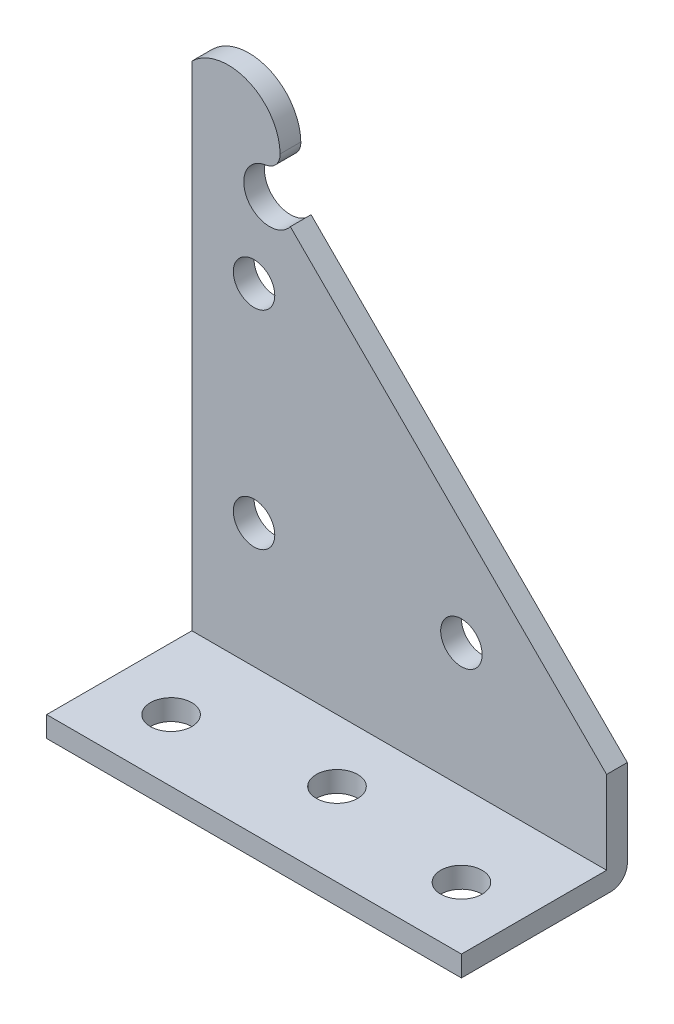
ISO-10303-21;
HEADER;
FILE_DESCRIPTION(('STEP AP214'),'2;1');
FILE_NAME('part.step','',(''),(''),'','','');
FILE_SCHEMA(('AUTOMOTIVE_DESIGN { 1 0 10303 214 1 1 1 1 }'));
ENDSEC;
DATA;
#1=APPLICATION_CONTEXT('core data for automotive mechanical design processes');
#2=APPLICATION_PROTOCOL_DEFINITION('international standard','automotive_design',2000,#1);
#3=PRODUCT_CONTEXT('',#1,'mechanical');
#4=PRODUCT('Part','Part','',(#3));
#5=PRODUCT_RELATED_PRODUCT_CATEGORY('part','',(#4));
#6=PRODUCT_DEFINITION_FORMATION('','',#4);
#7=PRODUCT_DEFINITION_CONTEXT('part definition',#1,'design');
#8=PRODUCT_DEFINITION('design','',#6,#7);
#9=PRODUCT_DEFINITION_SHAPE('','',#8);
#10=(LENGTH_UNIT() NAMED_UNIT(*) SI_UNIT(.MILLI.,.METRE.));
#11=(NAMED_UNIT(*) PLANE_ANGLE_UNIT() SI_UNIT($,.RADIAN.));
#12=(NAMED_UNIT(*) SI_UNIT($,.STERADIAN.) SOLID_ANGLE_UNIT());
#13=UNCERTAINTY_MEASURE_WITH_UNIT(LENGTH_MEASURE(1.E-05),#10,'distance_accuracy_value','');
#14=(GEOMETRIC_REPRESENTATION_CONTEXT(3) GLOBAL_UNCERTAINTY_ASSIGNED_CONTEXT((#13)) GLOBAL_UNIT_ASSIGNED_CONTEXT((#10,
#11,#12)) REPRESENTATION_CONTEXT('',''));
#15=CARTESIAN_POINT('',(0.,0.,0.));
#16=DIRECTION('',(0.,0.,1.));
#17=DIRECTION('',(1.,0.,0.));
#18=AXIS2_PLACEMENT_3D('',#15,#16,#17);
#19=CARTESIAN_POINT('',(0.,3.175,0.));
#20=DIRECTION('',(0.,1.,0.));
#21=DIRECTION('',(0.,0.,1.));
#22=AXIS2_PLACEMENT_3D('',#19,#20,#21);
#23=PLANE('',#22);
#24=DIRECTION('',(1.,0.,0.));
#25=VECTOR('',#24,1.);
#26=CARTESIAN_POINT('',(0.,3.175,-9.525));
#27=LINE('',#26,#25);
#28=CARTESIAN_POINT('',(-31.75,3.175,-9.525));
#29=VERTEX_POINT('',#28);
#30=CARTESIAN_POINT('',(31.75,3.175,-9.525));
#31=VERTEX_POINT('',#30);
#32=EDGE_CURVE('E117',#29,#31,#27,.T.);
#33=ORIENTED_EDGE('',*,*,#32,.F.);
#34=DIRECTION('',(0.,0.,1.));
#35=VECTOR('',#34,1.);
#36=CARTESIAN_POINT('',(-31.75,3.175,12.7));
#37=LINE('',#36,#35);
#38=CARTESIAN_POINT('',(-31.75,3.175,12.7));
#39=VERTEX_POINT('',#38);
#40=EDGE_CURVE('E184',#29,#39,#37,.T.);
#41=ORIENTED_EDGE('',*,*,#40,.T.);
#42=DIRECTION('',(1.,0.,0.));
#43=VECTOR('',#42,1.);
#44=CARTESIAN_POINT('',(31.75,3.175,12.7));
#45=LINE('',#44,#43);
#46=CARTESIAN_POINT('',(31.75,3.175,12.7));
#47=VERTEX_POINT('',#46);
#48=EDGE_CURVE('E186',#39,#47,#45,.T.);
#49=ORIENTED_EDGE('',*,*,#48,.T.);
#50=DIRECTION('',(0.,0.,-1.));
#51=VECTOR('',#50,1.);
#52=CARTESIAN_POINT('',(31.75,3.175,12.7));
#53=LINE('',#52,#51);
#54=EDGE_CURVE('E189',#47,#31,#53,.T.);
#55=ORIENTED_EDGE('',*,*,#54,.T.);
#56=EDGE_LOOP('',(#33,#41,#49,#55));
#57=FACE_BOUND('',#56,.T.);
#58=CARTESIAN_POINT('',(0.,3.175,0.));
#59=DIRECTION('',(0.,1.,0.));
#60=DIRECTION('',(0.,0.,1.));
#61=AXIS2_PLACEMENT_3D('',#58,#59,#60);
#62=CIRCLE('',#61,3.175);
#63=CARTESIAN_POINT('',(0.,3.175,3.175));
#64=VERTEX_POINT('',#63);
#65=EDGE_CURVE('E172',#64,#64,#62,.T.);
#66=ORIENTED_EDGE('',*,*,#65,.F.);
#67=EDGE_LOOP('',(#66));
#68=FACE_BOUND('',#67,.T.);
#69=CARTESIAN_POINT('',(-22.225,3.175,3.175));
#70=DIRECTION('',(0.,1.,0.));
#71=DIRECTION('',(0.,0.,1.));
#72=AXIS2_PLACEMENT_3D('',#69,#70,#71);
#73=CIRCLE('',#72,3.175);
#74=CARTESIAN_POINT('',(-22.225,3.175,6.35));
#75=VERTEX_POINT('',#74);
#76=EDGE_CURVE('E178',#75,#75,#73,.T.);
#77=ORIENTED_EDGE('',*,*,#76,.F.);
#78=EDGE_LOOP('',(#77));
#79=FACE_BOUND('',#78,.T.);
#80=CARTESIAN_POINT('',(22.225,3.175,3.175));
#81=DIRECTION('',(0.,1.,0.));
#82=DIRECTION('',(0.,0.,-1.));
#83=AXIS2_PLACEMENT_3D('',#80,#81,#82);
#84=CIRCLE('',#83,3.175);
#85=CARTESIAN_POINT('',(22.225,3.175,0.));
#86=VERTEX_POINT('',#85);
#87=EDGE_CURVE('E166',#86,#86,#84,.T.);
#88=ORIENTED_EDGE('',*,*,#87,.F.);
#89=EDGE_LOOP('',(#88));
#90=FACE_BOUND('',#89,.T.);
#91=ADVANCED_FACE('F32',(#57,#68,#79,#90),#23,.T.);
#92=CARTESIAN_POINT('',(0.,0.,0.));
#93=DIRECTION('',(0.,1.,0.));
#94=DIRECTION('',(0.,0.,1.));
#95=AXIS2_PLACEMENT_3D('',#92,#93,#94);
#96=PLANE('',#95);
#97=DIRECTION('',(0.,0.,1.));
#98=VECTOR('',#97,1.);
#99=CARTESIAN_POINT('',(-31.75,0.,12.7));
#100=LINE('',#99,#98);
#101=CARTESIAN_POINT('',(-31.75,0.,-10.16));
#102=VERTEX_POINT('',#101);
#103=CARTESIAN_POINT('',(-31.75,0.,12.7));
#104=VERTEX_POINT('',#103);
#105=EDGE_CURVE('E181',#102,#104,#100,.T.);
#106=ORIENTED_EDGE('',*,*,#105,.F.);
#107=DIRECTION('',(-1.,0.,0.));
#108=VECTOR('',#107,1.);
#109=CARTESIAN_POINT('',(0.,0.,-10.16));
#110=LINE('',#109,#108);
#111=CARTESIAN_POINT('',(31.75,0.,-10.16));
#112=VERTEX_POINT('',#111);
#113=EDGE_CURVE('E40',#102,#112,#110,.F.);
#114=ORIENTED_EDGE('',*,*,#113,.T.);
#115=DIRECTION('',(0.,0.,-1.));
#116=VECTOR('',#115,1.);
#117=CARTESIAN_POINT('',(31.75,0.,12.7));
#118=LINE('',#117,#116);
#119=CARTESIAN_POINT('',(31.75,0.,12.7));
#120=VERTEX_POINT('',#119);
#121=EDGE_CURVE('E187',#120,#112,#118,.T.);
#122=ORIENTED_EDGE('',*,*,#121,.F.);
#123=DIRECTION('',(1.,0.,0.));
#124=VECTOR('',#123,1.);
#125=CARTESIAN_POINT('',(31.75,0.,12.7));
#126=LINE('',#125,#124);
#127=EDGE_CURVE('E193',#104,#120,#126,.T.);
#128=ORIENTED_EDGE('',*,*,#127,.F.);
#129=EDGE_LOOP('',(#106,#114,#122,#128));
#130=FACE_BOUND('',#129,.T.);
#131=CARTESIAN_POINT('',(-22.225,0.,3.175));
#132=DIRECTION('',(0.,1.,0.));
#133=DIRECTION('',(0.,0.,1.));
#134=AXIS2_PLACEMENT_3D('',#131,#132,#133);
#135=CIRCLE('',#134,3.175);
#136=CARTESIAN_POINT('',(-22.225,0.,6.35));
#137=VERTEX_POINT('',#136);
#138=EDGE_CURVE('E175',#137,#137,#135,.T.);
#139=ORIENTED_EDGE('',*,*,#138,.T.);
#140=EDGE_LOOP('',(#139));
#141=FACE_BOUND('',#140,.T.);
#142=CARTESIAN_POINT('',(0.,0.,0.));
#143=DIRECTION('',(0.,1.,0.));
#144=DIRECTION('',(0.,0.,1.));
#145=AXIS2_PLACEMENT_3D('',#142,#143,#144);
#146=CIRCLE('',#145,3.175);
#147=CARTESIAN_POINT('',(0.,0.,3.175));
#148=VERTEX_POINT('',#147);
#149=EDGE_CURVE('E169',#148,#148,#146,.T.);
#150=ORIENTED_EDGE('',*,*,#149,.T.);
#151=EDGE_LOOP('',(#150));
#152=FACE_BOUND('',#151,.T.);
#153=CARTESIAN_POINT('',(22.225,0.,3.175));
#154=DIRECTION('',(0.,1.,0.));
#155=DIRECTION('',(0.,0.,-1.));
#156=AXIS2_PLACEMENT_3D('',#153,#154,#155);
#157=CIRCLE('',#156,3.175);
#158=CARTESIAN_POINT('',(22.225,0.,0.));
#159=VERTEX_POINT('',#158);
#160=EDGE_CURVE('E165',#159,#159,#157,.T.);
#161=ORIENTED_EDGE('',*,*,#160,.T.);
#162=EDGE_LOOP('',(#161));
#163=FACE_BOUND('',#162,.T.);
#164=ADVANCED_FACE('F238',(#130,#141,#152,#163),#96,.F.);
#165=CARTESIAN_POINT('',(-31.75,3.175,12.7));
#166=DIRECTION('',(1.,0.,0.));
#167=DIRECTION('',(0.,0.,-1.));
#168=AXIS2_PLACEMENT_3D('',#165,#166,#167);
#169=PLANE('',#168);
#170=DIRECTION('',(0.,-1.,0.));
#171=VECTOR('',#170,1.);
#172=CARTESIAN_POINT('',(-31.75,3.175,-12.7));
#173=LINE('',#172,#171);
#174=CARTESIAN_POINT('',(-31.75,78.7050670136892,-12.7));
#175=VERTEX_POINT('',#174);
#176=CARTESIAN_POINT('',(-31.75,2.54,-12.7));
#177=VERTEX_POINT('',#176);
#178=EDGE_CURVE('E191',#175,#177,#173,.T.);
#179=ORIENTED_EDGE('',*,*,#178,.T.);
#180=CARTESIAN_POINT('',(-31.75,2.54,-10.16));
#181=DIRECTION('',(1.,0.,0.));
#182=DIRECTION('',(0.,0.,-1.));
#183=AXIS2_PLACEMENT_3D('',#180,#181,#182);
#184=CIRCLE('',#183,2.54);
#185=EDGE_CURVE('E54',#177,#102,#184,.F.);
#186=ORIENTED_EDGE('',*,*,#185,.T.);
#187=ORIENTED_EDGE('',*,*,#105,.T.);
#188=DIRECTION('',(0.,-1.,0.));
#189=VECTOR('',#188,1.);
#190=CARTESIAN_POINT('',(-31.75,3.175,12.7));
#191=LINE('',#190,#189);
#192=EDGE_CURVE('E201',#39,#104,#191,.T.);
#193=ORIENTED_EDGE('',*,*,#192,.F.);
#194=ORIENTED_EDGE('',*,*,#40,.F.);
#195=DIRECTION('',(0.,-1.,0.));
#196=VECTOR('',#195,1.);
#197=CARTESIAN_POINT('',(-31.75,0.,-9.525));
#198=LINE('',#197,#196);
#199=CARTESIAN_POINT('',(-31.75,78.7050670136892,-9.525));
#200=VERTEX_POINT('',#199);
#201=EDGE_CURVE('E143',#200,#29,#198,.T.);
#202=ORIENTED_EDGE('',*,*,#201,.F.);
#203=DIRECTION('',(0.,0.,-1.));
#204=VECTOR('',#203,1.);
#205=CARTESIAN_POINT('',(-31.75,78.7050670136892,-9.525));
#206=LINE('',#205,#204);
#207=EDGE_CURVE('E145',#200,#175,#206,.T.);
#208=ORIENTED_EDGE('',*,*,#207,.T.);
#209=EDGE_LOOP('',(#179,#186,#187,#193,#194,#202,#208));
#210=FACE_BOUND('',#209,.T.);
#211=ADVANCED_FACE('F214',(#210),#169,.F.);
#212=CARTESIAN_POINT('',(31.75,3.175,12.7));
#213=DIRECTION('',(0.,0.,-1.));
#214=DIRECTION('',(-1.,0.,0.));
#215=AXIS2_PLACEMENT_3D('',#212,#213,#214);
#216=PLANE('',#215);
#217=ORIENTED_EDGE('',*,*,#127,.T.);
#218=DIRECTION('',(0.,-1.,0.));
#219=VECTOR('',#218,1.);
#220=CARTESIAN_POINT('',(31.75,3.175,12.7));
#221=LINE('',#220,#219);
#222=EDGE_CURVE('E198',#47,#120,#221,.T.);
#223=ORIENTED_EDGE('',*,*,#222,.F.);
#224=ORIENTED_EDGE('',*,*,#48,.F.);
#225=ORIENTED_EDGE('',*,*,#192,.T.);
#226=EDGE_LOOP('',(#217,#223,#224,#225));
#227=FACE_BOUND('',#226,.T.);
#228=ADVANCED_FACE('F254',(#227),#216,.F.);
#229=CARTESIAN_POINT('',(31.75,3.175,12.7));
#230=DIRECTION('',(-1.,0.,0.));
#231=DIRECTION('',(0.,0.,1.));
#232=AXIS2_PLACEMENT_3D('',#229,#230,#231);
#233=PLANE('',#232);
#234=ORIENTED_EDGE('',*,*,#121,.T.);
#235=CARTESIAN_POINT('',(31.75,2.54,-10.16));
#236=DIRECTION('',(-1.,0.,0.));
#237=DIRECTION('',(0.,0.,1.));
#238=AXIS2_PLACEMENT_3D('',#235,#236,#237);
#239=CIRCLE('',#238,2.54);
#240=CARTESIAN_POINT('',(31.75,2.54,-12.7));
#241=VERTEX_POINT('',#240);
#242=EDGE_CURVE('E11',#112,#241,#239,.F.);
#243=ORIENTED_EDGE('',*,*,#242,.T.);
#244=DIRECTION('',(0.,-1.,0.));
#245=VECTOR('',#244,1.);
#246=CARTESIAN_POINT('',(31.75,3.175,-12.7));
#247=LINE('',#246,#245);
#248=CARTESIAN_POINT('',(31.75,15.875,-12.7));
#249=VERTEX_POINT('',#248);
#250=EDGE_CURVE('E126',#249,#241,#247,.T.);
#251=ORIENTED_EDGE('',*,*,#250,.F.);
#252=DIRECTION('',(0.,0.,-1.));
#253=VECTOR('',#252,1.);
#254=CARTESIAN_POINT('',(31.75,15.875,-9.525));
#255=LINE('',#254,#253);
#256=CARTESIAN_POINT('',(31.75,15.875,-9.525));
#257=VERTEX_POINT('',#256);
#258=EDGE_CURVE('E123',#257,#249,#255,.T.);
#259=ORIENTED_EDGE('',*,*,#258,.F.);
#260=DIRECTION('',(0.,1.,0.));
#261=VECTOR('',#260,1.);
#262=CARTESIAN_POINT('',(31.75,0.,-9.525));
#263=LINE('',#262,#261);
#264=EDGE_CURVE('E108',#31,#257,#263,.T.);
#265=ORIENTED_EDGE('',*,*,#264,.F.);
#266=ORIENTED_EDGE('',*,*,#54,.F.);
#267=ORIENTED_EDGE('',*,*,#222,.T.);
#268=EDGE_LOOP('',(#234,#243,#251,#259,#265,#266,#267));
#269=FACE_BOUND('',#268,.T.);
#270=ADVANCED_FACE('F124',(#269),#233,.F.);
#271=CARTESIAN_POINT('',(31.75,3.175,-12.7));
#272=DIRECTION('',(0.,0.,1.));
#273=DIRECTION('',(1.,0.,0.));
#274=AXIS2_PLACEMENT_3D('',#271,#272,#273);
#275=PLANE('',#274);
#276=ORIENTED_EDGE('',*,*,#250,.T.);
#277=DIRECTION('',(-1.,0.,0.));
#278=VECTOR('',#277,1.);
#279=CARTESIAN_POINT('',(31.75,2.54,-12.7));
#280=LINE('',#279,#278);
#281=EDGE_CURVE('E204',#241,#177,#280,.T.);
#282=ORIENTED_EDGE('',*,*,#281,.T.);
#283=ORIENTED_EDGE('',*,*,#178,.F.);
#284=CARTESIAN_POINT('',(-26.1874,73.025,-12.7));
#285=DIRECTION('',(0.,0.,1.));
#286=DIRECTION('',(-1.,0.,0.));
#287=AXIS2_PLACEMENT_3D('',#284,#285,#286);
#288=CIRCLE('',#287,7.9502);
#289=CARTESIAN_POINT('',(-18.2381590173172,73.1484821413682,-12.7));
#290=VERTEX_POINT('',#289);
#291=EDGE_CURVE('E120',#290,#175,#288,.T.);
#292=ORIENTED_EDGE('',*,*,#291,.F.);
#293=CARTESIAN_POINT('',(-20.7778526220082,73.1090309779918,-12.7));
#294=DIRECTION('',(0.,0.,1.));
#295=DIRECTION('',(-1.,0.,0.));
#296=AXIS2_PLACEMENT_3D('',#293,#294,#295);
#297=CIRCLE('',#296,2.54000000000001);
#298=CARTESIAN_POINT('',(-20.4104883165363,70.5957376272138,-12.7));
#299=VERTEX_POINT('',#298);
#300=EDGE_CURVE('E151',#299,#290,#297,.T.);
#301=ORIENTED_EDGE('',*,*,#300,.F.);
#302=CARTESIAN_POINT('',(-19.8374,66.675,-12.7));
#303=DIRECTION('',(0.,0.,-1.));
#304=DIRECTION('',(1.,0.,0.));
#305=AXIS2_PLACEMENT_3D('',#302,#303,#304);
#306=CIRCLE('',#305,3.96240000000001);
#307=CARTESIAN_POINT('',(-16.6696583294408,64.2946583294403,-12.7));
#308=VERTEX_POINT('',#307);
#309=EDGE_CURVE('E148',#308,#299,#306,.T.);
#310=ORIENTED_EDGE('',*,*,#309,.F.);
#311=DIRECTION('',(-0.707106781186551,0.707106781186544,0.));
#312=VECTOR('',#311,1.);
#313=CARTESIAN_POINT('',(31.75,15.875,-12.7));
#314=LINE('',#313,#312);
#315=EDGE_CURVE('E146',#249,#308,#314,.T.);
#316=ORIENTED_EDGE('',*,*,#315,.F.);
#317=EDGE_LOOP('',(#276,#282,#283,#292,#301,#310,#316));
#318=FACE_BOUND('',#317,.T.);
#319=CARTESIAN_POINT('',(-22.225,22.225,-12.7));
#320=DIRECTION('',(0.,0.,1.));
#321=DIRECTION('',(1.,0.,0.));
#322=AXIS2_PLACEMENT_3D('',#319,#320,#321);
#323=CIRCLE('',#322,3.175);
#324=CARTESIAN_POINT('',(-19.05,22.225,-12.7));
#325=VERTEX_POINT('',#324);
#326=EDGE_CURVE('E426',#325,#325,#323,.T.);
#327=ORIENTED_EDGE('',*,*,#326,.T.);
#328=EDGE_LOOP('',(#327));
#329=FACE_BOUND('',#328,.T.);
#330=CARTESIAN_POINT('',(-22.225,53.975,-12.7));
#331=DIRECTION('',(0.,0.,1.));
#332=DIRECTION('',(1.,0.,0.));
#333=AXIS2_PLACEMENT_3D('',#330,#331,#332);
#334=CIRCLE('',#333,3.175);
#335=CARTESIAN_POINT('',(-19.05,53.975,-12.7));
#336=VERTEX_POINT('',#335);
#337=EDGE_CURVE('E420',#336,#336,#334,.T.);
#338=ORIENTED_EDGE('',*,*,#337,.T.);
#339=EDGE_LOOP('',(#338));
#340=FACE_BOUND('',#339,.T.);
#341=CARTESIAN_POINT('',(9.525,22.225,-12.7));
#342=DIRECTION('',(0.,0.,1.));
#343=DIRECTION('',(1.,0.,0.));
#344=AXIS2_PLACEMENT_3D('',#341,#342,#343);
#345=CIRCLE('',#344,3.175);
#346=CARTESIAN_POINT('',(12.7,22.225,-12.7));
#347=VERTEX_POINT('',#346);
#348=EDGE_CURVE('E417',#347,#347,#345,.T.);
#349=ORIENTED_EDGE('',*,*,#348,.T.);
#350=EDGE_LOOP('',(#349));
#351=FACE_BOUND('',#350,.T.);
#352=ADVANCED_FACE('F209',(#318,#329,#340,#351),#275,.F.);
#353=CARTESIAN_POINT('',(-22.225,3.175,3.175));
#354=DIRECTION('',(0.,-1.,0.));
#355=DIRECTION('',(0.,0.,-1.));
#356=AXIS2_PLACEMENT_3D('',#353,#354,#355);
#357=CYLINDRICAL_SURFACE('',#356,3.175);
#358=ORIENTED_EDGE('',*,*,#76,.T.);
#359=EDGE_LOOP('',(#358));
#360=FACE_BOUND('',#359,.T.);
#361=ORIENTED_EDGE('',*,*,#138,.F.);
#362=EDGE_LOOP('',(#361));
#363=FACE_BOUND('',#362,.T.);
#364=ADVANCED_FACE('F247',(#360,#363),#357,.F.);
#365=CARTESIAN_POINT('',(0.,3.175,0.));
#366=DIRECTION('',(0.,-1.,0.));
#367=DIRECTION('',(0.,0.,-1.));
#368=AXIS2_PLACEMENT_3D('',#365,#366,#367);
#369=CYLINDRICAL_SURFACE('',#368,3.175);
#370=ORIENTED_EDGE('',*,*,#65,.T.);
#371=EDGE_LOOP('',(#370));
#372=FACE_BOUND('',#371,.T.);
#373=ORIENTED_EDGE('',*,*,#149,.F.);
#374=EDGE_LOOP('',(#373));
#375=FACE_BOUND('',#374,.T.);
#376=ADVANCED_FACE('F281',(#372,#375),#369,.F.);
#377=CARTESIAN_POINT('',(22.225,3.175,3.175));
#378=DIRECTION('',(0.,-1.,0.));
#379=DIRECTION('',(0.,0.,-1.));
#380=AXIS2_PLACEMENT_3D('',#377,#378,#379);
#381=CYLINDRICAL_SURFACE('',#380,3.175);
#382=ORIENTED_EDGE('',*,*,#87,.T.);
#383=EDGE_LOOP('',(#382));
#384=FACE_BOUND('',#383,.T.);
#385=ORIENTED_EDGE('',*,*,#160,.F.);
#386=EDGE_LOOP('',(#385));
#387=FACE_BOUND('',#386,.T.);
#388=ADVANCED_FACE('F288',(#384,#387),#381,.F.);
#389=CARTESIAN_POINT('',(-19.8374,66.675,-9.525));
#390=DIRECTION('',(0.,0.,1.));
#391=DIRECTION('',(1.,0.,0.));
#392=AXIS2_PLACEMENT_3D('',#389,#390,#391);
#393=PLANE('',#392);
#394=CARTESIAN_POINT('',(-22.225,53.975,-9.525));
#395=DIRECTION('',(0.,0.,1.));
#396=DIRECTION('',(1.,0.,0.));
#397=AXIS2_PLACEMENT_3D('',#394,#395,#396);
#398=CIRCLE('',#397,3.175);
#399=CARTESIAN_POINT('',(-19.05,53.975,-9.525));
#400=VERTEX_POINT('',#399);
#401=EDGE_CURVE('E423',#400,#400,#398,.T.);
#402=ORIENTED_EDGE('',*,*,#401,.F.);
#403=EDGE_LOOP('',(#402));
#404=FACE_BOUND('',#403,.T.);
#405=ORIENTED_EDGE('',*,*,#201,.T.);
#406=ORIENTED_EDGE('',*,*,#32,.T.);
#407=ORIENTED_EDGE('',*,*,#264,.T.);
#408=DIRECTION('',(-0.707106781186551,0.707106781186544,0.));
#409=VECTOR('',#408,1.);
#410=CARTESIAN_POINT('',(31.75,15.875,-9.525));
#411=LINE('',#410,#409);
#412=CARTESIAN_POINT('',(-16.6696583294408,64.2946583294403,-9.525));
#413=VERTEX_POINT('',#412);
#414=EDGE_CURVE('E114',#257,#413,#411,.T.);
#415=ORIENTED_EDGE('',*,*,#414,.T.);
#416=CARTESIAN_POINT('',(-19.8374,66.675,-9.525));
#417=DIRECTION('',(0.,0.,-1.));
#418=DIRECTION('',(1.,0.,0.));
#419=AXIS2_PLACEMENT_3D('',#416,#417,#418);
#420=CIRCLE('',#419,3.96240000000001);
#421=CARTESIAN_POINT('',(-20.4104883165363,70.5957376272138,-9.525));
#422=VERTEX_POINT('',#421);
#423=EDGE_CURVE('E134',#413,#422,#420,.T.);
#424=ORIENTED_EDGE('',*,*,#423,.T.);
#425=CARTESIAN_POINT('',(-20.7778526220082,73.1090309779918,-9.525));
#426=DIRECTION('',(0.,0.,1.));
#427=DIRECTION('',(-1.,0.,0.));
#428=AXIS2_PLACEMENT_3D('',#425,#426,#427);
#429=CIRCLE('',#428,2.54000000000001);
#430=CARTESIAN_POINT('',(-18.2381590173172,73.1484821413682,-9.525));
#431=VERTEX_POINT('',#430);
#432=EDGE_CURVE('E136',#422,#431,#429,.T.);
#433=ORIENTED_EDGE('',*,*,#432,.T.);
#434=CARTESIAN_POINT('',(-26.1874,73.025,-9.525));
#435=DIRECTION('',(0.,0.,1.));
#436=DIRECTION('',(-1.,0.,0.));
#437=AXIS2_PLACEMENT_3D('',#434,#435,#436);
#438=CIRCLE('',#437,7.9502);
#439=EDGE_CURVE('E141',#431,#200,#438,.T.);
#440=ORIENTED_EDGE('',*,*,#439,.T.);
#441=EDGE_LOOP('',(#405,#406,#407,#415,#424,#433,#440));
#442=FACE_BOUND('',#441,.T.);
#443=CARTESIAN_POINT('',(-22.225,22.225,-9.525));
#444=DIRECTION('',(0.,0.,1.));
#445=DIRECTION('',(1.,0.,0.));
#446=AXIS2_PLACEMENT_3D('',#443,#444,#445);
#447=CIRCLE('',#446,3.175);
#448=CARTESIAN_POINT('',(-19.05,22.225,-9.525));
#449=VERTEX_POINT('',#448);
#450=EDGE_CURVE('E149',#449,#449,#447,.T.);
#451=ORIENTED_EDGE('',*,*,#450,.F.);
#452=EDGE_LOOP('',(#451));
#453=FACE_BOUND('',#452,.T.);
#454=CARTESIAN_POINT('',(9.525,22.225,-9.525));
#455=DIRECTION('',(0.,0.,1.));
#456=DIRECTION('',(1.,0.,0.));
#457=AXIS2_PLACEMENT_3D('',#454,#455,#456);
#458=CIRCLE('',#457,3.175);
#459=CARTESIAN_POINT('',(12.7,22.225,-9.525));
#460=VERTEX_POINT('',#459);
#461=EDGE_CURVE('E414',#460,#460,#458,.T.);
#462=ORIENTED_EDGE('',*,*,#461,.F.);
#463=EDGE_LOOP('',(#462));
#464=FACE_BOUND('',#463,.T.);
#465=ADVANCED_FACE('F111',(#404,#442,#453,#464),#393,.T.);
#466=CARTESIAN_POINT('',(31.75,15.875,-9.525));
#467=DIRECTION('',(-0.707106781186544,-0.707106781186551,0.));
#468=DIRECTION('',(0.707106781186551,-0.707106781186544,0.));
#469=AXIS2_PLACEMENT_3D('',#466,#467,#468);
#470=PLANE('',#469);
#471=ORIENTED_EDGE('',*,*,#315,.T.);
#472=DIRECTION('',(0.,0.,-1.));
#473=VECTOR('',#472,1.);
#474=CARTESIAN_POINT('',(-16.6696583294408,64.2946583294403,-9.525));
#475=LINE('',#474,#473);
#476=EDGE_CURVE('E129',#413,#308,#475,.T.);
#477=ORIENTED_EDGE('',*,*,#476,.F.);
#478=ORIENTED_EDGE('',*,*,#414,.F.);
#479=ORIENTED_EDGE('',*,*,#258,.T.);
#480=EDGE_LOOP('',(#471,#477,#478,#479));
#481=FACE_BOUND('',#480,.T.);
#482=ADVANCED_FACE('F131',(#481),#470,.F.);
#483=CARTESIAN_POINT('',(-19.8374,66.675,-9.525));
#484=DIRECTION('',(0.,0.,-1.));
#485=DIRECTION('',(-1.,0.,0.));
#486=AXIS2_PLACEMENT_3D('',#483,#484,#485);
#487=CYLINDRICAL_SURFACE('',#486,3.96240000000001);
#488=ORIENTED_EDGE('',*,*,#309,.T.);
#489=DIRECTION('',(0.,0.,-1.));
#490=VECTOR('',#489,1.);
#491=CARTESIAN_POINT('',(-20.4104883165363,70.5957376272138,-9.525));
#492=LINE('',#491,#490);
#493=EDGE_CURVE('E160',#422,#299,#492,.T.);
#494=ORIENTED_EDGE('',*,*,#493,.F.);
#495=ORIENTED_EDGE('',*,*,#423,.F.);
#496=ORIENTED_EDGE('',*,*,#476,.T.);
#497=EDGE_LOOP('',(#488,#494,#495,#496));
#498=FACE_BOUND('',#497,.T.);
#499=ADVANCED_FACE('F228',(#498),#487,.F.);
#500=CARTESIAN_POINT('',(-20.7778526220082,73.1090309779918,-9.525));
#501=DIRECTION('',(0.,0.,-1.));
#502=DIRECTION('',(-1.,0.,0.));
#503=AXIS2_PLACEMENT_3D('',#500,#501,#502);
#504=CYLINDRICAL_SURFACE('',#503,2.54000000000001);
#505=ORIENTED_EDGE('',*,*,#300,.T.);
#506=DIRECTION('',(0.,0.,-1.));
#507=VECTOR('',#506,1.);
#508=CARTESIAN_POINT('',(-18.2381590173172,73.1484821413682,-9.525));
#509=LINE('',#508,#507);
#510=EDGE_CURVE('E157',#431,#290,#509,.T.);
#511=ORIENTED_EDGE('',*,*,#510,.F.);
#512=ORIENTED_EDGE('',*,*,#432,.F.);
#513=ORIENTED_EDGE('',*,*,#493,.T.);
#514=EDGE_LOOP('',(#505,#511,#512,#513));
#515=FACE_BOUND('',#514,.T.);
#516=ADVANCED_FACE('F224',(#515),#504,.T.);
#517=CARTESIAN_POINT('',(-26.1874,73.025,-9.525));
#518=DIRECTION('',(0.,0.,-1.));
#519=DIRECTION('',(-1.,0.,0.));
#520=AXIS2_PLACEMENT_3D('',#517,#518,#519);
#521=CYLINDRICAL_SURFACE('',#520,7.9502);
#522=ORIENTED_EDGE('',*,*,#291,.T.);
#523=ORIENTED_EDGE('',*,*,#207,.F.);
#524=ORIENTED_EDGE('',*,*,#439,.F.);
#525=ORIENTED_EDGE('',*,*,#510,.T.);
#526=EDGE_LOOP('',(#522,#523,#524,#525));
#527=FACE_BOUND('',#526,.T.);
#528=ADVANCED_FACE('F219',(#527),#521,.T.);
#529=CARTESIAN_POINT('',(-22.225,22.225,-9.525));
#530=DIRECTION('',(0.,0.,-1.));
#531=DIRECTION('',(-1.,0.,0.));
#532=AXIS2_PLACEMENT_3D('',#529,#530,#531);
#533=CYLINDRICAL_SURFACE('',#532,3.175);
#534=ORIENTED_EDGE('',*,*,#450,.T.);
#535=EDGE_LOOP('',(#534));
#536=FACE_BOUND('',#535,.T.);
#537=ORIENTED_EDGE('',*,*,#326,.F.);
#538=EDGE_LOOP('',(#537));
#539=FACE_BOUND('',#538,.T.);
#540=ADVANCED_FACE('F326',(#536,#539),#533,.F.);
#541=CARTESIAN_POINT('',(-22.225,53.975,-9.525));
#542=DIRECTION('',(0.,0.,-1.));
#543=DIRECTION('',(-1.,0.,0.));
#544=AXIS2_PLACEMENT_3D('',#541,#542,#543);
#545=CYLINDRICAL_SURFACE('',#544,3.175);
#546=ORIENTED_EDGE('',*,*,#401,.T.);
#547=EDGE_LOOP('',(#546));
#548=FACE_BOUND('',#547,.T.);
#549=ORIENTED_EDGE('',*,*,#337,.F.);
#550=EDGE_LOOP('',(#549));
#551=FACE_BOUND('',#550,.T.);
#552=ADVANCED_FACE('F335',(#548,#551),#545,.F.);
#553=CARTESIAN_POINT('',(9.525,22.225,-9.525));
#554=DIRECTION('',(0.,0.,-1.));
#555=DIRECTION('',(-1.,0.,0.));
#556=AXIS2_PLACEMENT_3D('',#553,#554,#555);
#557=CYLINDRICAL_SURFACE('',#556,3.175);
#558=ORIENTED_EDGE('',*,*,#461,.T.);
#559=EDGE_LOOP('',(#558));
#560=FACE_BOUND('',#559,.T.);
#561=ORIENTED_EDGE('',*,*,#348,.F.);
#562=EDGE_LOOP('',(#561));
#563=FACE_BOUND('',#562,.T.);
#564=ADVANCED_FACE('F345',(#560,#563),#557,.F.);
#565=CARTESIAN_POINT('',(31.75,2.54,-10.16));
#566=DIRECTION('',(-1.,0.,0.));
#567=DIRECTION('',(0.,0.,1.));
#568=AXIS2_PLACEMENT_3D('',#565,#566,#567);
#569=CYLINDRICAL_SURFACE('',#568,2.54);
#570=ORIENTED_EDGE('',*,*,#242,.F.);
#571=ORIENTED_EDGE('',*,*,#113,.F.);
#572=ORIENTED_EDGE('',*,*,#185,.F.);
#573=ORIENTED_EDGE('',*,*,#281,.F.);
#574=EDGE_LOOP('',(#570,#571,#572,#573));
#575=FACE_BOUND('',#574,.T.);
#576=ADVANCED_FACE('F34',(#575),#569,.T.);
#577=CLOSED_SHELL('',(#91,#164,#211,#228,#270,#352,#364,#376,#388,#465,#482,#499,#516,#528,#540,
#552,#564,#576));
#578=MANIFOLD_SOLID_BREP('B2',#577);
#579=ADVANCED_BREP_SHAPE_REPRESENTATION('',(#18,#578),#14);
#580=SHAPE_DEFINITION_REPRESENTATION(#9,#579);
ENDSEC;
END-ISO-10303-21;
